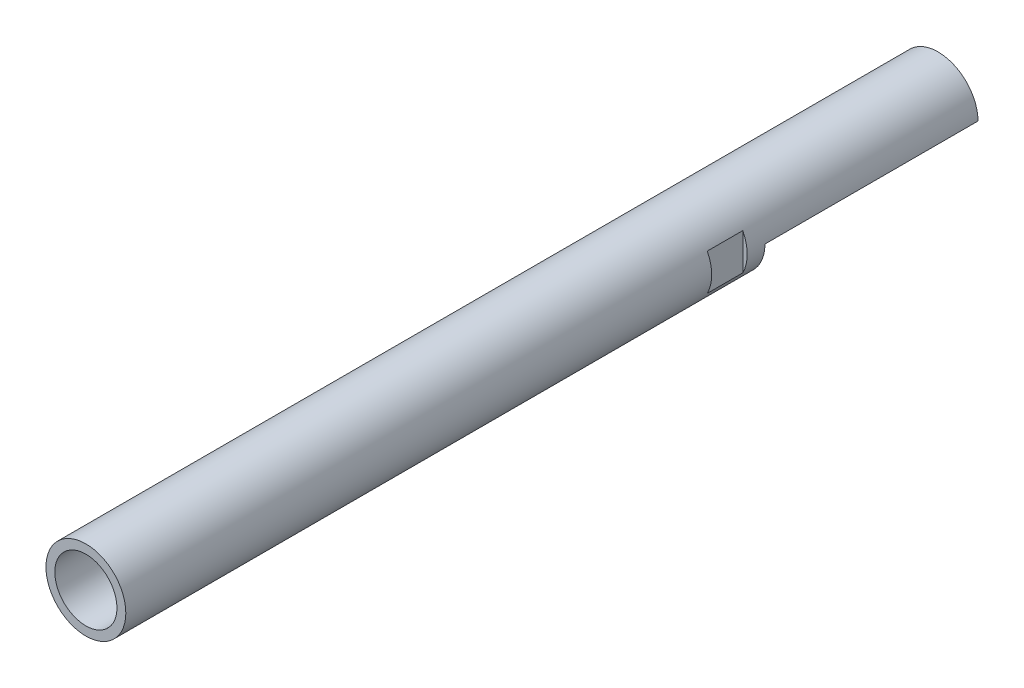
ISO-10303-21;
HEADER;
FILE_DESCRIPTION(('STEP AP214'),'2;1');
FILE_NAME('part.step','',(''),(''),'','','');
FILE_SCHEMA(('AUTOMOTIVE_DESIGN { 1 0 10303 214 1 1 1 1 }'));
ENDSEC;
DATA;
#1=APPLICATION_CONTEXT('core data for automotive mechanical design processes');
#2=APPLICATION_PROTOCOL_DEFINITION('international standard','automotive_design',2000,#1);
#3=PRODUCT_CONTEXT('',#1,'mechanical');
#4=PRODUCT('Part','Part','',(#3));
#5=PRODUCT_RELATED_PRODUCT_CATEGORY('part','',(#4));
#6=PRODUCT_DEFINITION_FORMATION('','',#4);
#7=PRODUCT_DEFINITION_CONTEXT('part definition',#1,'design');
#8=PRODUCT_DEFINITION('design','',#6,#7);
#9=PRODUCT_DEFINITION_SHAPE('','',#8);
#10=(LENGTH_UNIT() NAMED_UNIT(*) SI_UNIT(.MILLI.,.METRE.));
#11=(NAMED_UNIT(*) PLANE_ANGLE_UNIT() SI_UNIT($,.RADIAN.));
#12=(NAMED_UNIT(*) SI_UNIT($,.STERADIAN.) SOLID_ANGLE_UNIT());
#13=UNCERTAINTY_MEASURE_WITH_UNIT(LENGTH_MEASURE(1.E-05),#10,'distance_accuracy_value','');
#14=(GEOMETRIC_REPRESENTATION_CONTEXT(3) GLOBAL_UNCERTAINTY_ASSIGNED_CONTEXT((#13)) GLOBAL_UNIT_ASSIGNED_CONTEXT((#10,
#11,#12)) REPRESENTATION_CONTEXT('',''));
#15=CARTESIAN_POINT('',(0.,0.,0.));
#16=DIRECTION('',(0.,0.,1.));
#17=DIRECTION('',(1.,0.,0.));
#18=AXIS2_PLACEMENT_3D('',#15,#16,#17);
#19=CARTESIAN_POINT('',(0.,0.,304.8));
#20=DIRECTION('',(0.,0.,-1.));
#21=DIRECTION('',(-1.,0.,0.));
#22=AXIS2_PLACEMENT_3D('',#19,#20,#21);
#23=CYLINDRICAL_SURFACE('',#22,14.2875);
#24=CARTESIAN_POINT('',(0.,0.,95.25));
#25=DIRECTION('',(0.,0.,-1.));
#26=DIRECTION('',(-1.,0.,0.));
#27=AXIS2_PLACEMENT_3D('',#24,#25,#26);
#28=CIRCLE('',#27,14.2875);
#29=CARTESIAN_POINT('',(12.7,6.54543018066803,95.25));
#30=VERTEX_POINT('',#29);
#31=CARTESIAN_POINT('',(12.7,-6.54543018066804,95.25));
#32=VERTEX_POINT('',#31);
#33=EDGE_CURVE('E129',#30,#32,#28,.T.);
#34=ORIENTED_EDGE('',*,*,#33,.F.);
#35=DIRECTION('',(0.,0.,-1.));
#36=VECTOR('',#35,1.);
#37=CARTESIAN_POINT('',(12.7,6.54543018066803,95.25));
#38=LINE('',#37,#36);
#39=CARTESIAN_POINT('',(12.7,6.54543018066803,82.55));
#40=VERTEX_POINT('',#39);
#41=EDGE_CURVE('E133',#30,#40,#38,.T.);
#42=ORIENTED_EDGE('',*,*,#41,.T.);
#43=CARTESIAN_POINT('',(0.,0.,82.55));
#44=DIRECTION('',(0.,0.,-1.));
#45=DIRECTION('',(-1.,0.,0.));
#46=AXIS2_PLACEMENT_3D('',#43,#44,#45);
#47=CIRCLE('',#46,14.2875);
#48=CARTESIAN_POINT('',(12.7,-6.54543018066803,82.55));
#49=VERTEX_POINT('',#48);
#50=EDGE_CURVE('E130',#40,#49,#47,.T.);
#51=ORIENTED_EDGE('',*,*,#50,.T.);
#52=DIRECTION('',(0.,0.,-1.));
#53=VECTOR('',#52,1.);
#54=CARTESIAN_POINT('',(12.7,-6.54543018066804,95.25));
#55=LINE('',#54,#53);
#56=EDGE_CURVE('E123',#32,#49,#55,.T.);
#57=ORIENTED_EDGE('',*,*,#56,.F.);
#58=EDGE_LOOP('',(#34,#42,#51,#57));
#59=FACE_BOUND('',#58,.T.);
#60=CARTESIAN_POINT('',(0.,0.,304.8));
#61=DIRECTION('',(0.,0.,1.));
#62=DIRECTION('',(1.,0.,0.));
#63=AXIS2_PLACEMENT_3D('',#60,#61,#62);
#64=CIRCLE('',#63,14.2875);
#65=CARTESIAN_POINT('',(14.2875,0.,304.8));
#66=VERTEX_POINT('',#65);
#67=EDGE_CURVE('E11',#66,#66,#64,.T.);
#68=ORIENTED_EDGE('',*,*,#67,.F.);
#69=EDGE_LOOP('',(#68));
#70=FACE_BOUND('',#69,.T.);
#71=CARTESIAN_POINT('',(0.,0.,76.2));
#72=DIRECTION('',(0.,0.,-1.));
#73=DIRECTION('',(-1.,0.,0.));
#74=AXIS2_PLACEMENT_3D('',#71,#72,#73);
#75=CIRCLE('',#74,14.2875);
#76=CARTESIAN_POINT('',(14.2875,0.,76.2));
#77=VERTEX_POINT('',#76);
#78=CARTESIAN_POINT('',(-14.2875,0.,76.2));
#79=VERTEX_POINT('',#78);
#80=EDGE_CURVE('E141',#77,#79,#75,.T.);
#81=ORIENTED_EDGE('',*,*,#80,.F.);
#82=DIRECTION('',(0.,0.,-1.));
#83=VECTOR('',#82,1.);
#84=CARTESIAN_POINT('',(14.2875,0.,76.2));
#85=LINE('',#84,#83);
#86=CARTESIAN_POINT('',(14.2875,0.,0.));
#87=VERTEX_POINT('',#86);
#88=EDGE_CURVE('E150',#77,#87,#85,.T.);
#89=ORIENTED_EDGE('',*,*,#88,.T.);
#90=CARTESIAN_POINT('',(0.,0.,0.));
#91=DIRECTION('',(0.,0.,1.));
#92=DIRECTION('',(1.,0.,0.));
#93=AXIS2_PLACEMENT_3D('',#90,#91,#92);
#94=CIRCLE('',#93,14.2875);
#95=CARTESIAN_POINT('',(-14.2875,0.,0.));
#96=VERTEX_POINT('',#95);
#97=EDGE_CURVE('E45',#87,#96,#94,.T.);
#98=ORIENTED_EDGE('',*,*,#97,.T.);
#99=DIRECTION('',(0.,0.,-1.));
#100=VECTOR('',#99,1.);
#101=CARTESIAN_POINT('',(-14.2875,0.,76.2));
#102=LINE('',#101,#100);
#103=EDGE_CURVE('E148',#79,#96,#102,.T.);
#104=ORIENTED_EDGE('',*,*,#103,.F.);
#105=EDGE_LOOP('',(#81,#89,#98,#104));
#106=FACE_BOUND('',#105,.T.);
#107=CARTESIAN_POINT('',(0.,0.,95.25));
#108=DIRECTION('',(0.,0.,-1.));
#109=DIRECTION('',(-1.,0.,0.));
#110=AXIS2_PLACEMENT_3D('',#107,#108,#109);
#111=CIRCLE('',#110,14.2875);
#112=CARTESIAN_POINT('',(6.54543018066803,-12.7,95.25));
#113=VERTEX_POINT('',#112);
#114=CARTESIAN_POINT('',(-6.54543018066803,-12.7,95.25));
#115=VERTEX_POINT('',#114);
#116=EDGE_CURVE('E111',#113,#115,#111,.T.);
#117=ORIENTED_EDGE('',*,*,#116,.F.);
#118=DIRECTION('',(0.,0.,-1.));
#119=VECTOR('',#118,1.);
#120=CARTESIAN_POINT('',(6.54543018066803,-12.7,95.25));
#121=LINE('',#120,#119);
#122=CARTESIAN_POINT('',(6.54543018066803,-12.7,82.55));
#123=VERTEX_POINT('',#122);
#124=EDGE_CURVE('E102',#113,#123,#121,.T.);
#125=ORIENTED_EDGE('',*,*,#124,.T.);
#126=CARTESIAN_POINT('',(0.,0.,82.55));
#127=DIRECTION('',(0.,0.,-1.));
#128=DIRECTION('',(-1.,0.,0.));
#129=AXIS2_PLACEMENT_3D('',#126,#127,#128);
#130=CIRCLE('',#129,14.2875);
#131=CARTESIAN_POINT('',(-6.54543018066803,-12.7,82.55));
#132=VERTEX_POINT('',#131);
#133=EDGE_CURVE('E116',#123,#132,#130,.T.);
#134=ORIENTED_EDGE('',*,*,#133,.T.);
#135=DIRECTION('',(0.,0.,-1.));
#136=VECTOR('',#135,1.);
#137=CARTESIAN_POINT('',(-6.54543018066803,-12.7,95.25));
#138=LINE('',#137,#136);
#139=EDGE_CURVE('E110',#115,#132,#138,.T.);
#140=ORIENTED_EDGE('',*,*,#139,.F.);
#141=EDGE_LOOP('',(#117,#125,#134,#140));
#142=FACE_BOUND('',#141,.T.);
#143=CARTESIAN_POINT('',(-3.175,-13.930255964985,171.45));
#144=CARTESIAN_POINT('',(-3.17499404604868,-13.930259519501,171.625962258749));
#145=CARTESIAN_POINT('',(-3.16032218368744,-13.9336263325875,171.801995442595));
#146=CARTESIAN_POINT('',(-3.10208967570228,-13.9467040574412,172.149050586416));
#147=CARTESIAN_POINT('',(-3.05850857851012,-13.9564194603865,172.320068909173));
#148=CARTESIAN_POINT('',(-2.94390188320744,-13.9810409414811,172.652023920353));
#149=CARTESIAN_POINT('',(-2.87290695420969,-13.9959412172404,172.812971642226));
#150=CARTESIAN_POINT('',(-2.70557630453557,-14.029246552643,173.120677073703));
#151=CARTESIAN_POINT('',(-2.60924093365102,-14.047651563907,173.267434979142));
#152=CARTESIAN_POINT('',(-2.39217370591358,-14.0862510896236,173.545154832047));
#153=CARTESIAN_POINT('',(-2.27108337024511,-14.1064691172362,173.675833372365));
#154=CARTESIAN_POINT('',(-2.00871721519604,-14.1462109672236,173.915201369497));
#155=CARTESIAN_POINT('',(-1.86743979669659,-14.1657347344495,174.023889082659));
#156=CARTESIAN_POINT('',(-1.56680526306462,-14.2021447732274,174.21731531784));
#157=CARTESIAN_POINT('',(-1.40726829374625,-14.219000064093,174.301780633507));
#158=CARTESIAN_POINT('',(-1.07582705784745,-14.2479081363258,174.442595935231));
#159=CARTESIAN_POINT('',(-0.903924227211027,-14.2599614742443,174.498949179698));
#160=CARTESIAN_POINT('',(-0.555578639171222,-14.2777413909176,174.58104757479));
#161=CARTESIAN_POINT('',(-0.379254112365793,-14.2835670469651,174.607272560856));
#162=CARTESIAN_POINT('',(-0.0246184067353089,-14.2885786896136,174.62987088001));
#163=CARTESIAN_POINT('',(0.153692535319015,-14.2877654592567,174.62624773362));
#164=CARTESIAN_POINT('',(0.503929524483275,-14.2796664709516,174.589608715538));
#165=CARTESIAN_POINT('',(0.675912707619356,-14.2724946262242,174.557110119443));
#166=CARTESIAN_POINT('',(1.01192146730017,-14.2526143271741,174.464467765256));
#167=CARTESIAN_POINT('',(1.17594667614171,-14.2399056172874,174.404322731085));
#168=CARTESIAN_POINT('',(1.4928116089081,-14.2101973003647,174.257641428615));
#169=CARTESIAN_POINT('',(1.64555808316925,-14.1931661867752,174.170910362486));
#170=CARTESIAN_POINT('',(1.93451660426487,-14.1566784379842,173.973664475856));
#171=CARTESIAN_POINT('',(2.07072632689939,-14.1372214626108,173.863146318176));
#172=CARTESIAN_POINT('',(2.32582242095956,-14.0975265059119,173.618651692258));
#173=CARTESIAN_POINT('',(2.44427409683097,-14.0772807252366,173.484222538146));
#174=CARTESIAN_POINT('',(2.65703531045117,-14.0386803528947,173.197198138158));
#175=CARTESIAN_POINT('',(2.75134415041243,-14.0203258158989,173.044602367408));
#176=CARTESIAN_POINT('',(2.91334453391602,-13.9875646328247,172.724857927247));
#177=CARTESIAN_POINT('',(2.98095157937149,-13.9731705625883,172.557665071298));
#178=CARTESIAN_POINT('',(3.08697740368037,-13.9501326612632,172.213895203089));
#179=CARTESIAN_POINT('',(3.1254009782066,-13.9414878854313,172.037319737763));
#180=CARTESIAN_POINT('',(3.17128999504126,-13.9311206720645,171.683775270537));
#181=CARTESIAN_POINT('',(3.1793894179382,-13.9292564979198,171.506892616963));
#182=CARTESIAN_POINT('',(3.16611869036104,-13.9322788482822,171.15430443479));
#183=CARTESIAN_POINT('',(3.1447506349786,-13.9371648928594,170.978598823396));
#184=CARTESIAN_POINT('',(3.07370221749834,-13.9530030866465,170.63557513423));
#185=CARTESIAN_POINT('',(3.02437312088927,-13.9638799283206,170.468180501719));
#186=CARTESIAN_POINT('',(2.89918418032709,-13.9904058599556,170.144032598082));
#187=CARTESIAN_POINT('',(2.8233217299964,-14.0060554187221,169.987280374169));
#188=CARTESIAN_POINT('',(2.64583021389399,-14.0406735005904,169.68612938218));
#189=CARTESIAN_POINT('',(2.54381181722467,-14.0596906963536,169.541965787461));
#190=CARTESIAN_POINT('',(2.31741193066364,-14.0987739044538,169.272571732614));
#191=CARTESIAN_POINT('',(2.19302756963037,-14.1188400512109,169.147343707067));
#192=CARTESIAN_POINT('',(1.92255332820072,-14.1582288260966,168.91690349218));
#193=CARTESIAN_POINT('',(1.7760908881151,-14.1775296321132,168.812124218057));
#194=CARTESIAN_POINT('',(1.46727570740137,-14.2128067191643,168.628656686903));
#195=CARTESIAN_POINT('',(1.30492372176574,-14.2287831580436,168.549967190994));
#196=CARTESIAN_POINT('',(0.969965516255228,-14.2555196334235,168.421510193019));
#197=CARTESIAN_POINT('',(0.797433616226865,-14.2663132284701,168.371556201518));
#198=CARTESIAN_POINT('',(0.446159075287994,-14.2816131801047,168.301407808474));
#199=CARTESIAN_POINT('',(0.26741737208123,-14.2861204817538,168.281208933617));
#200=CARTESIAN_POINT('',(-0.0870979422953432,-14.2883108188044,168.271350682989));
#201=CARTESIAN_POINT('',(-0.262853020356216,-14.286138103284,168.281045786328));
#202=CARTESIAN_POINT('',(-0.610162040668767,-14.275522732602,168.329252734009));
#203=CARTESIAN_POINT('',(-0.781716063157475,-14.267080197286,168.367764027538));
#204=CARTESIAN_POINT('',(-1.11523507709879,-14.2448857383981,168.472196642047));
#205=CARTESIAN_POINT('',(-1.27723087619186,-14.2311520842578,168.538023705442));
#206=CARTESIAN_POINT('',(-1.58796280084769,-14.1998396361702,168.695128388119));
#207=CARTESIAN_POINT('',(-1.73669759306774,-14.1822604561825,168.786408562811));
#208=CARTESIAN_POINT('',(-2.0198253029721,-14.1447437865216,168.993918865473));
#209=CARTESIAN_POINT('',(-2.15388151644881,-14.1247669543449,169.110601319157));
#210=CARTESIAN_POINT('',(-2.40073137511054,-14.0849144764458,169.364695141618));
#211=CARTESIAN_POINT('',(-2.51351986498645,-14.0650388563904,169.502111521817));
#212=CARTESIAN_POINT('',(-2.71614663687899,-14.0273305013928,169.796070268413));
#213=CARTESIAN_POINT('',(-2.80564408799535,-14.0095300058213,169.952851954076));
#214=CARTESIAN_POINT('',(-2.95687791790409,-13.9783953379605,170.279594821402));
#215=CARTESIAN_POINT('',(-3.01863745352613,-13.9650574424787,170.449544870018));
#216=CARTESIAN_POINT('',(-3.10180592276854,-13.9467847451289,170.758019027563));
#217=CARTESIAN_POINT('',(-3.12920034001176,-13.940628146666,170.894888440797));
#218=CARTESIAN_POINT('',(-3.16579926545841,-13.9323624532779,171.171157143571));
#219=CARTESIAN_POINT('',(-3.17500471829016,-13.9302531481602,171.310556301352));
#220=CARTESIAN_POINT('',(-3.175,-13.930255964985,171.45));
#221=B_SPLINE_CURVE_WITH_KNOTS('',3,(#143,#144,#145,#146,#147,#148,#149,#150,#151,#152,#153,
#154,#155,#156,#157,#158,#159,#160,#161,#162,#163,#164,#165,#166,#167,#168,#169,#170,#171,#172,
#173,#174,#175,#176,#177,#178,#179,#180,#181,#182,#183,#184,#185,#186,#187,#188,#189,#190,#191,
#192,#193,#194,#195,#196,#197,#198,#199,#200,#201,#202,#203,#204,#205,#206,#207,#208,#209,#210,
#211,#212,#213,#214,#215,#216,#217,#218,#219,#220),.UNSPECIFIED.,.T.,.F.,(4,2,2,2,2,2,2,2,2,2,2,
2,2,2,2,2,2,2,2,2,2,2,2,2,2,2,2,2,2,2,2,2,2,2,2,2,2,2,4),(0.,0.527375623270274,1.05512473195785,
1.58228512612352,2.10943824390794,2.64484792847433,3.18030004903129,3.72157327570461,
4.26278374999437,4.79524967222896,5.32765279219154,5.85070651422449,6.37378438131147,
6.90079039585308,7.42787039426262,7.96626625085543,8.50467766666054,9.04477949502387,
9.58479255010871,10.1134505235966,10.6420709122667,11.1641930950071,11.6863665803431,
12.2168162560825,12.7473340748624,13.2880901059809,13.8288204555144,14.366000755148,
14.9031002881155,15.4286837026383,15.9542570710682,16.4780317470367,17.0018590272636,
17.5359134526346,18.0700971671722,18.6117066731651,19.1528631754363,19.5708109075415,
19.988736933318),.UNSPECIFIED.);
#222=CARTESIAN_POINT('',(-3.175,-13.930255964985,171.45));
#223=VERTEX_POINT('',#222);
#224=EDGE_CURVE('E135',#223,#223,#221,.T.);
#225=ORIENTED_EDGE('',*,*,#224,.T.);
#226=EDGE_LOOP('',(#225));
#227=FACE_BOUND('',#226,.T.);
#228=ADVANCED_FACE('F37',(#59,#70,#106,#142,#227),#23,.T.);
#229=CARTESIAN_POINT('',(0.,0.,304.8));
#230=DIRECTION('',(0.,0.,-1.));
#231=DIRECTION('',(-1.,0.,0.));
#232=AXIS2_PLACEMENT_3D('',#229,#230,#231);
#233=CYLINDRICAL_SURFACE('',#232,9.525);
#234=CARTESIAN_POINT('',(0.,0.,285.75));
#235=DIRECTION('',(0.,0.,1.));
#236=DIRECTION('',(1.,0.,0.));
#237=AXIS2_PLACEMENT_3D('',#234,#235,#236);
#238=CIRCLE('',#237,9.525);
#239=CARTESIAN_POINT('',(9.525,0.,285.75));
#240=VERTEX_POINT('',#239);
#241=EDGE_CURVE('E40',#240,#240,#238,.T.);
#242=ORIENTED_EDGE('',*,*,#241,.T.);
#243=EDGE_LOOP('',(#242));
#244=FACE_BOUND('',#243,.T.);
#245=DIRECTION('',(0.,0.,-1.));
#246=VECTOR('',#245,1.);
#247=CARTESIAN_POINT('',(9.525,0.,304.8));
#248=LINE('',#247,#246);
#249=CARTESIAN_POINT('',(9.525,0.,76.2));
#250=VERTEX_POINT('',#249);
#251=CARTESIAN_POINT('',(9.52499999999999,0.,0.));
#252=VERTEX_POINT('',#251);
#253=EDGE_CURVE('E159',#250,#252,#248,.T.);
#254=ORIENTED_EDGE('',*,*,#253,.F.);
#255=CARTESIAN_POINT('',(0.,0.,76.2));
#256=DIRECTION('',(0.,0.,-1.));
#257=DIRECTION('',(-1.,0.,0.));
#258=AXIS2_PLACEMENT_3D('',#255,#256,#257);
#259=CIRCLE('',#258,9.525);
#260=CARTESIAN_POINT('',(-9.525,0.,76.2));
#261=VERTEX_POINT('',#260);
#262=EDGE_CURVE('E153',#250,#261,#259,.T.);
#263=ORIENTED_EDGE('',*,*,#262,.T.);
#264=DIRECTION('',(0.,0.,-1.));
#265=VECTOR('',#264,1.);
#266=CARTESIAN_POINT('',(-9.525,0.,304.8));
#267=LINE('',#266,#265);
#268=CARTESIAN_POINT('',(-9.525,0.,0.));
#269=VERTEX_POINT('',#268);
#270=EDGE_CURVE('E157',#269,#261,#267,.F.);
#271=ORIENTED_EDGE('',*,*,#270,.F.);
#272=CARTESIAN_POINT('',(0.,0.,0.));
#273=DIRECTION('',(0.,0.,1.));
#274=DIRECTION('',(1.,0.,0.));
#275=AXIS2_PLACEMENT_3D('',#272,#273,#274);
#276=CIRCLE('',#275,9.525);
#277=EDGE_CURVE('E167',#252,#269,#276,.T.);
#278=ORIENTED_EDGE('',*,*,#277,.F.);
#279=EDGE_LOOP('',(#254,#263,#271,#278));
#280=FACE_BOUND('',#279,.T.);
#281=CARTESIAN_POINT('',(3.175,-8.98025612106916,171.45));
#282=CARTESIAN_POINT('',(3.17500081898398,-8.98025555134128,171.622936455105));
#283=CARTESIAN_POINT('',(3.16082293820153,-8.98530617498472,171.79586798944));
#284=CARTESIAN_POINT('',(3.10467734311197,-9.00485797707984,172.136607786657));
#285=CARTESIAN_POINT('',(3.06270505113466,-9.01936071226449,172.304415200845));
#286=CARTESIAN_POINT('',(2.95260866704957,-9.05599546711914,172.629915385266));
#287=CARTESIAN_POINT('',(2.8845358279553,-9.07811252608947,172.787627275981));
#288=CARTESIAN_POINT('',(2.72434567030138,-9.12746212382781,173.08944315414));
#289=CARTESIAN_POINT('',(2.63222304663108,-9.15469579088969,173.233544129608));
#290=CARTESIAN_POINT('',(2.42268738995613,-9.21240503868728,173.509685880424));
#291=CARTESIAN_POINT('',(2.30449228387488,-9.24296141131745,173.641116486033));
#292=CARTESIAN_POINT('',(2.04783584340568,-9.30319020743185,173.882706593888));
#293=CARTESIAN_POINT('',(1.90937126079127,-9.33286248831954,173.992862680274));
#294=CARTESIAN_POINT('',(1.61164431278889,-9.38891527476712,174.191545499021));
#295=CARTESIAN_POINT('',(1.45193356813785,-9.41518969452598,174.279432906712));
#296=CARTESIAN_POINT('',(1.11896913298521,-9.46053437997871,174.42685328278));
#297=CARTESIAN_POINT('',(0.945719107056872,-9.47960658694532,174.486393892837));
#298=CARTESIAN_POINT('',(0.596991495351313,-9.50782564496304,174.573361338458));
#299=CARTESIAN_POINT('',(0.421801146658144,-9.5172947441875,174.601833441866));
#300=CARTESIAN_POINT('',(0.0688907525664557,-9.52638456092937,174.62917923142));
#301=CARTESIAN_POINT('',(-0.108828629001898,-9.52600781684693,174.628060546496));
#302=CARTESIAN_POINT('',(-0.454353660740387,-9.51566675789472,174.596919491753));
#303=CARTESIAN_POINT('',(-0.622274754278534,-9.50607905597498,174.568032472093));
#304=CARTESIAN_POINT('',(-0.950732918260417,-9.47886621303647,174.484052285387));
#305=CARTESIAN_POINT('',(-1.11126948744903,-9.46124052729002,174.428957342239));
#306=CARTESIAN_POINT('',(-1.42288410762328,-9.41945253180987,174.293462317553));
#307=CARTESIAN_POINT('',(-1.5738101015761,-9.39520735013749,174.212739145115));
#308=CARTESIAN_POINT('',(-1.86030973354927,-9.34270397898568,174.0285454352));
#309=CARTESIAN_POINT('',(-1.99587908667348,-9.31444467439657,173.925068572435));
#310=CARTESIAN_POINT('',(-2.25457025130042,-9.25532159123421,173.692583800765));
#311=CARTESIAN_POINT('',(-2.37680549868225,-9.22439783161186,173.562603223853));
#312=CARTESIAN_POINT('',(-2.59803029922421,-9.16455289415259,173.283725295818));
#313=CARTESIAN_POINT('',(-2.69701626991891,-9.13563202542328,173.134825034813));
#314=CARTESIAN_POINT('',(-2.8701601697385,-9.08273917259531,172.819524738709));
#315=CARTESIAN_POINT('',(-2.94394402199776,-9.05884361979074,172.652905483066));
#316=CARTESIAN_POINT('',(-3.06210713863015,-9.01959241367421,172.308610823369));
#317=CARTESIAN_POINT('',(-3.1064987264983,-9.00423318171519,172.13094008717));
#318=CARTESIAN_POINT('',(-3.16281207065963,-8.98460345301983,171.778173221568));
#319=CARTESIAN_POINT('',(-3.17610837823673,-8.9798639401205,171.603322576423));
#320=CARTESIAN_POINT('',(-3.17374726853836,-8.9806993378791,171.253860726563));
#321=CARTESIAN_POINT('',(-3.15809511009497,-8.98627237514011,171.079249484124));
#322=CARTESIAN_POINT('',(-3.09951644367858,-9.00663737436701,170.741476633865));
#323=CARTESIAN_POINT('',(-3.05754530088867,-9.02110608274668,170.578127759271));
#324=CARTESIAN_POINT('',(-2.94866651362948,-9.05727657905498,170.260824050191));
#325=CARTESIAN_POINT('',(-2.88175444845385,-9.07897964918116,170.106870886699));
#326=CARTESIAN_POINT('',(-2.72248103184611,-9.12802586366624,169.807317163811));
#327=CARTESIAN_POINT('',(-2.62937980078821,-9.15552606488371,169.662136409612));
#328=CARTESIAN_POINT('',(-2.42120937702023,-9.21276315720815,169.388961283682));
#329=CARTESIAN_POINT('',(-2.30613370845861,-9.24250070609048,169.260971997251));
#330=CARTESIAN_POINT('',(-2.05070616623351,-9.30259247675171,169.019448650512));
#331=CARTESIAN_POINT('',(-1.9094045839856,-9.33290753359822,168.90690631169));
#332=CARTESIAN_POINT('',(-1.6091766501958,-9.38932753871621,168.707066248045));
#333=CARTESIAN_POINT('',(-1.45025092494493,-9.41543263651181,168.619767626559));
#334=CARTESIAN_POINT('',(-1.12007606322252,-9.46036988448665,168.473691167064));
#335=CARTESIAN_POINT('',(-0.948915816544782,-9.47924920264386,168.414727695055));
#336=CARTESIAN_POINT('',(-0.598355629061083,-9.50781089409934,168.326664418959));
#337=CARTESIAN_POINT('',(-0.418958686953577,-9.5174965870801,168.297553835129));
#338=CARTESIAN_POINT('',(-0.0660886913556076,-9.52632915775114,168.270992903602));
#339=CARTESIAN_POINT('',(0.107266498446079,-9.52594996283969,168.272118833765));
#340=CARTESIAN_POINT('',(0.45120288537557,-9.51586223949089,168.302486953365));
#341=CARTESIAN_POINT('',(0.621784306400523,-9.50615446789103,168.331726861885));
#342=CARTESIAN_POINT('',(0.952633729196801,-9.47867404980259,168.416548594779));
#343=CARTESIAN_POINT('',(1.11302251014812,-9.46103195296647,168.471704633746));
#344=CARTESIAN_POINT('',(1.42233126423386,-9.41949985236771,168.606398661233));
#345=CARTESIAN_POINT('',(1.57124915665223,-9.39560871852452,168.685941060251));
#346=CARTESIAN_POINT('',(1.8593880017804,-9.34294133528522,168.870533200924));
#347=CARTESIAN_POINT('',(1.99804734869541,-9.31401720161867,168.976416826087));
#348=CARTESIAN_POINT('',(2.25609475841496,-9.25490239414218,169.209267216921));
#349=CARTESIAN_POINT('',(2.37547664865808,-9.22471131854584,169.336240709184));
#350=CARTESIAN_POINT('',(2.59633024304515,-9.16505913446274,169.613609703989));
#351=CARTESIAN_POINT('',(2.69691791704333,-9.13567286363902,169.764727497351));
#352=CARTESIAN_POINT('',(2.87119803998104,-9.08241113800574,170.082636805416));
#353=CARTESIAN_POINT('',(2.94489751640183,-9.05853424386967,170.249424210369));
#354=CARTESIAN_POINT('',(3.06020415454822,-9.02021736105684,170.58627879125));
#355=CARTESIAN_POINT('',(3.10311136154972,-9.00539959321554,170.755856936693));
#356=CARTESIAN_POINT('',(3.16050396647392,-8.98542092737971,171.100292960232));
#357=CARTESIAN_POINT('',(3.17499917194918,-8.9802566971044,171.275148995279));
#358=CARTESIAN_POINT('',(3.175,-8.98025612106916,171.45));
#359=B_SPLINE_CURVE_WITH_KNOTS('',3,(#281,#282,#283,#284,#285,#286,#287,#288,#289,#290,#291,
#292,#293,#294,#295,#296,#297,#298,#299,#300,#301,#302,#303,#304,#305,#306,#307,#308,#309,#310,
#311,#312,#313,#314,#315,#316,#317,#318,#319,#320,#321,#322,#323,#324,#325,#326,#327,#328,#329,
#330,#331,#332,#333,#334,#335,#336,#337,#338,#339,#340,#341,#342,#343,#344,#345,#346,#347,#348,
#349,#350,#351,#352,#353,#354,#355,#356,#357,#358),.UNSPECIFIED.,.T.,.F.,(4,2,2,2,2,2,2,2,2,2,2,
2,2,2,2,2,2,2,2,2,2,2,2,2,2,2,2,2,2,2,2,2,2,2,2,2,2,2,4),(0.,0.518161856737926,1.03640907467316,
1.55364379231514,2.07099270263877,2.6067174633253,3.14252816921063,3.69231882006113,
4.24196117528058,4.77247962078669,5.30286129234891,5.81244090321183,6.32205505300828,
6.83836754181565,7.35482374200021,7.89559553605441,8.43645060268438,8.98501631501702,
9.53335188057257,10.0569487508209,10.5804505128322,11.0859695656586,11.5915782629155,
12.113223733109,12.6350231697726,13.1819271594322,13.7288117205517,14.2720628703095,
14.815117785382,15.3326491885149,15.8501386073106,16.3594083542837,16.868770261733,
17.3969527447801,17.9253040157361,18.4743376618725,19.023227709973,19.5473069861654,
20.0712053232972),.UNSPECIFIED.);
#360=CARTESIAN_POINT('',(3.175,-8.98025612106916,171.45));
#361=VERTEX_POINT('',#360);
#362=EDGE_CURVE('E350',#361,#361,#359,.T.);
#363=ORIENTED_EDGE('',*,*,#362,.T.);
#364=EDGE_LOOP('',(#363));
#365=FACE_BOUND('',#364,.T.);
#366=ADVANCED_FACE('F185',(#244,#280,#365),#233,.F.);
#367=CARTESIAN_POINT('',(0.,0.,304.8));
#368=DIRECTION('',(0.,0.,1.));
#369=DIRECTION('',(1.,0.,0.));
#370=AXIS2_PLACEMENT_3D('',#367,#368,#369);
#371=PLANE('',#370);
#372=CARTESIAN_POINT('',(0.,0.,304.8));
#373=DIRECTION('',(0.,0.,1.));
#374=DIRECTION('',(1.,0.,0.));
#375=AXIS2_PLACEMENT_3D('',#372,#373,#374);
#376=CIRCLE('',#375,11.1125);
#377=CARTESIAN_POINT('',(11.1125,0.,304.8));
#378=VERTEX_POINT('',#377);
#379=EDGE_CURVE('E161',#378,#378,#376,.T.);
#380=ORIENTED_EDGE('',*,*,#379,.F.);
#381=EDGE_LOOP('',(#380));
#382=FACE_BOUND('',#381,.T.);
#383=ORIENTED_EDGE('',*,*,#67,.T.);
#384=EDGE_LOOP('',(#383));
#385=FACE_BOUND('',#384,.T.);
#386=ADVANCED_FACE('F209',(#382,#385),#371,.T.);
#387=CARTESIAN_POINT('',(0.,0.,0.));
#388=DIRECTION('',(0.,0.,1.));
#389=DIRECTION('',(1.,0.,0.));
#390=AXIS2_PLACEMENT_3D('',#387,#388,#389);
#391=PLANE('',#390);
#392=ORIENTED_EDGE('',*,*,#97,.F.);
#393=DIRECTION('',(1.,0.,0.));
#394=VECTOR('',#393,1.);
#395=CARTESIAN_POINT('',(-14.2875,0.,0.));
#396=LINE('',#395,#394);
#397=EDGE_CURVE('E125',#252,#87,#396,.T.);
#398=ORIENTED_EDGE('',*,*,#397,.F.);
#399=ORIENTED_EDGE('',*,*,#277,.T.);
#400=EDGE_CURVE('E144',#96,#269,#396,.T.);
#401=ORIENTED_EDGE('',*,*,#400,.F.);
#402=EDGE_LOOP('',(#392,#398,#399,#401));
#403=FACE_BOUND('',#402,.T.);
#404=ADVANCED_FACE('F177',(#403),#391,.F.);
#405=CARTESIAN_POINT('',(0.,0.,285.75));
#406=DIRECTION('',(0.,0.,1.));
#407=DIRECTION('',(1.,0.,0.));
#408=AXIS2_PLACEMENT_3D('',#405,#406,#407);
#409=CYLINDRICAL_SURFACE('',#408,11.1125);
#410=CARTESIAN_POINT('',(0.,0.,285.75));
#411=DIRECTION('',(0.,0.,1.));
#412=DIRECTION('',(1.,0.,0.));
#413=AXIS2_PLACEMENT_3D('',#410,#411,#412);
#414=CIRCLE('',#413,11.1125);
#415=CARTESIAN_POINT('',(11.1125,0.,285.75));
#416=VERTEX_POINT('',#415);
#417=EDGE_CURVE('E162',#416,#416,#414,.T.);
#418=CARTESIAN_POINT('',(11.1125,0.,285.75));
#419=CARTESIAN_POINT('',(11.1125,0.,285.9484375));
#420=CARTESIAN_POINT('',(11.1125,0.,286.146875));
#421=CARTESIAN_POINT('',(11.1125,0.,286.54375));
#422=CARTESIAN_POINT('',(11.1125,0.,286.7421875));
#423=CARTESIAN_POINT('',(11.1125,0.,287.1390625));
#424=CARTESIAN_POINT('',(11.1125,0.,287.3375));
#425=CARTESIAN_POINT('',(11.1125,0.,287.734375));
#426=CARTESIAN_POINT('',(11.1125,0.,287.9328125));
#427=CARTESIAN_POINT('',(11.1125,0.,288.3296875));
#428=CARTESIAN_POINT('',(11.1125,0.,288.528125));
#429=CARTESIAN_POINT('',(11.1125,0.,288.925));
#430=CARTESIAN_POINT('',(11.1125,0.,289.1234375));
#431=CARTESIAN_POINT('',(11.1125,0.,289.5203125));
#432=CARTESIAN_POINT('',(11.1125,0.,289.71875));
#433=CARTESIAN_POINT('',(11.1125,0.,290.115625));
#434=CARTESIAN_POINT('',(11.1125,0.,290.3140625));
#435=CARTESIAN_POINT('',(11.1125,0.,290.7109375));
#436=CARTESIAN_POINT('',(11.1125,0.,290.909375));
#437=CARTESIAN_POINT('',(11.1125,0.,291.30625));
#438=CARTESIAN_POINT('',(11.1125,0.,291.5046875));
#439=CARTESIAN_POINT('',(11.1125,0.,291.9015625));
#440=CARTESIAN_POINT('',(11.1125,0.,292.1));
#441=CARTESIAN_POINT('',(11.1125,0.,292.496875));
#442=CARTESIAN_POINT('',(11.1125,0.,292.6953125));
#443=CARTESIAN_POINT('',(11.1125,0.,293.0921875));
#444=CARTESIAN_POINT('',(11.1125,0.,293.290625));
#445=CARTESIAN_POINT('',(11.1125,0.,293.6875));
#446=CARTESIAN_POINT('',(11.1125,0.,293.8859375));
#447=CARTESIAN_POINT('',(11.1125,0.,294.2828125));
#448=CARTESIAN_POINT('',(11.1125,0.,294.48125));
#449=CARTESIAN_POINT('',(11.1125,0.,294.878125));
#450=CARTESIAN_POINT('',(11.1125,0.,295.0765625));
#451=CARTESIAN_POINT('',(11.1125,0.,295.4734375));
#452=CARTESIAN_POINT('',(11.1125,0.,295.671875));
#453=CARTESIAN_POINT('',(11.1125,0.,296.06875));
#454=CARTESIAN_POINT('',(11.1125,0.,296.2671875));
#455=CARTESIAN_POINT('',(11.1125,0.,296.6640625));
#456=CARTESIAN_POINT('',(11.1125,0.,296.8625));
#457=CARTESIAN_POINT('',(11.1125,0.,297.259375));
#458=CARTESIAN_POINT('',(11.1125,0.,297.4578125));
#459=CARTESIAN_POINT('',(11.1125,0.,297.8546875));
#460=CARTESIAN_POINT('',(11.1125,0.,298.053125));
#461=CARTESIAN_POINT('',(11.1125,0.,298.45));
#462=CARTESIAN_POINT('',(11.1125,0.,298.6484375));
#463=CARTESIAN_POINT('',(11.1125,0.,299.0453125));
#464=CARTESIAN_POINT('',(11.1125,0.,299.24375));
#465=CARTESIAN_POINT('',(11.1125,0.,299.640625));
#466=CARTESIAN_POINT('',(11.1125,0.,299.8390625));
#467=CARTESIAN_POINT('',(11.1125,0.,300.2359375));
#468=CARTESIAN_POINT('',(11.1125,0.,300.434375));
#469=CARTESIAN_POINT('',(11.1125,0.,300.83125));
#470=CARTESIAN_POINT('',(11.1125,0.,301.0296875));
#471=CARTESIAN_POINT('',(11.1125,0.,301.4265625));
#472=CARTESIAN_POINT('',(11.1125,0.,301.625));
#473=CARTESIAN_POINT('',(11.1125,0.,302.021875));
#474=CARTESIAN_POINT('',(11.1125,0.,302.2203125));
#475=CARTESIAN_POINT('',(11.1125,0.,302.6171875));
#476=CARTESIAN_POINT('',(11.1125,0.,302.815625));
#477=CARTESIAN_POINT('',(11.1125,0.,303.2125));
#478=CARTESIAN_POINT('',(11.1125,0.,303.4109375));
#479=CARTESIAN_POINT('',(11.1125,0.,303.8078125));
#480=CARTESIAN_POINT('',(11.1125,0.,304.00625));
#481=CARTESIAN_POINT('',(11.1125,0.,304.403125));
#482=CARTESIAN_POINT('',(11.1125,0.,304.6015625));
#483=CARTESIAN_POINT('',(11.1125,0.,304.8));
#484=B_SPLINE_CURVE_WITH_KNOTS('',3,(#418,#419,#420,#421,#422,#423,#424,#425,#426,#427,#428,
#429,#430,#431,#432,#433,#434,#435,#436,#437,#438,#439,#440,#441,#442,#443,#444,#445,#446,#447,
#448,#449,#450,#451,#452,#453,#454,#455,#456,#457,#458,#459,#460,#461,#462,#463,#464,#465,#466,
#467,#468,#469,#470,#471,#472,#473,#474,#475,#476,#477,#478,#479,#480,#481,#482,#483),
.UNSPECIFIED.,.F.,.F.,(4,2,2,2,2,2,2,2,2,2,2,2,2,2,2,2,2,2,2,2,2,2,2,2,2,2,2,2,2,2,2,2,4),(0.,
0.5953125,1.190625,1.7859375,2.38125,2.9765625,3.571875,4.1671875,4.7625,5.3578125,5.953125,
6.5484375,7.14375,7.7390625,8.334375,8.92968750000001,9.52500000000001,10.1203125,10.715625,
11.3109375,11.90625,12.5015625,13.096875,13.6921875,14.2875,14.8828125,15.478125,16.0734375,
16.66875,17.2640625,17.859375,18.4546875,19.05),.UNSPECIFIED.);
#485=EDGE_CURVE('BSEAM200',#416,#378,#484,.T.);
#486=ORIENTED_EDGE('',*,*,#417,.F.);
#487=ORIENTED_EDGE('',*,*,#379,.T.);
#488=ORIENTED_EDGE('',*,*,#485,.T.);
#489=ORIENTED_EDGE('',*,*,#485,.F.);
#490=EDGE_LOOP('',(#486,#488,#487,#489));
#491=FACE_BOUND('',#490,.T.);
#492=ADVANCED_FACE('F200',(#491),#409,.F.);
#493=CARTESIAN_POINT('',(0.,0.,285.75));
#494=DIRECTION('',(0.,0.,1.));
#495=DIRECTION('',(1.,0.,0.));
#496=AXIS2_PLACEMENT_3D('',#493,#494,#495);
#497=PLANE('',#496);
#498=ORIENTED_EDGE('',*,*,#241,.F.);
#499=EDGE_LOOP('',(#498));
#500=FACE_BOUND('',#499,.T.);
#501=ORIENTED_EDGE('',*,*,#417,.T.);
#502=EDGE_LOOP('',(#501));
#503=FACE_BOUND('',#502,.T.);
#504=ADVANCED_FACE('F194',(#500,#503),#497,.T.);
#505=CARTESIAN_POINT('',(-14.2875,0.,76.2));
#506=DIRECTION('',(0.,1.,0.));
#507=DIRECTION('',(0.,0.,1.));
#508=AXIS2_PLACEMENT_3D('',#505,#506,#507);
#509=PLANE('',#508);
#510=ORIENTED_EDGE('',*,*,#253,.T.);
#511=ORIENTED_EDGE('',*,*,#397,.T.);
#512=ORIENTED_EDGE('',*,*,#88,.F.);
#513=DIRECTION('',(1.,0.,0.));
#514=VECTOR('',#513,1.);
#515=CARTESIAN_POINT('',(-14.2875,0.,76.2));
#516=LINE('',#515,#514);
#517=EDGE_CURVE('E143',#250,#77,#516,.T.);
#518=ORIENTED_EDGE('',*,*,#517,.F.);
#519=EDGE_LOOP('',(#510,#511,#512,#518));
#520=FACE_BOUND('',#519,.T.);
#521=ADVANCED_FACE('F192',(#520),#509,.F.);
#522=ORIENTED_EDGE('',*,*,#270,.T.);
#523=EDGE_CURVE('E145',#79,#261,#516,.T.);
#524=ORIENTED_EDGE('',*,*,#523,.F.);
#525=ORIENTED_EDGE('',*,*,#103,.T.);
#526=ORIENTED_EDGE('',*,*,#400,.T.);
#527=EDGE_LOOP('',(#522,#524,#525,#526));
#528=FACE_BOUND('',#527,.T.);
#529=ADVANCED_FACE('F181',(#528),#509,.F.);
#530=CARTESIAN_POINT('',(0.,0.,76.2));
#531=DIRECTION('',(0.,0.,-1.));
#532=DIRECTION('',(-1.,0.,0.));
#533=AXIS2_PLACEMENT_3D('',#530,#531,#532);
#534=PLANE('',#533);
#535=ORIENTED_EDGE('',*,*,#517,.T.);
#536=ORIENTED_EDGE('',*,*,#80,.T.);
#537=ORIENTED_EDGE('',*,*,#523,.T.);
#538=ORIENTED_EDGE('',*,*,#262,.F.);
#539=EDGE_LOOP('',(#535,#536,#537,#538));
#540=FACE_BOUND('',#539,.T.);
#541=ADVANCED_FACE('F190',(#540),#534,.T.);
#542=CARTESIAN_POINT('',(12.7,0.,95.25));
#543=DIRECTION('',(1.,0.,0.));
#544=DIRECTION('',(0.,1.,0.));
#545=AXIS2_PLACEMENT_3D('',#542,#543,#544);
#546=PLANE('',#545);
#547=DIRECTION('',(0.,-1.,0.));
#548=VECTOR('',#547,1.);
#549=CARTESIAN_POINT('',(12.7,0.,82.55));
#550=LINE('',#549,#548);
#551=EDGE_CURVE('E59',#40,#49,#550,.T.);
#552=ORIENTED_EDGE('',*,*,#551,.F.);
#553=ORIENTED_EDGE('',*,*,#41,.F.);
#554=DIRECTION('',(0.,-1.,0.));
#555=VECTOR('',#554,1.);
#556=CARTESIAN_POINT('',(12.7,0.,95.25));
#557=LINE('',#556,#555);
#558=EDGE_CURVE('E127',#30,#32,#557,.T.);
#559=ORIENTED_EDGE('',*,*,#558,.T.);
#560=ORIENTED_EDGE('',*,*,#56,.T.);
#561=EDGE_LOOP('',(#552,#553,#559,#560));
#562=FACE_BOUND('',#561,.T.);
#563=ADVANCED_FACE('F262',(#562),#546,.T.);
#564=CARTESIAN_POINT('',(0.,0.,95.25));
#565=DIRECTION('',(0.,0.,-1.));
#566=DIRECTION('',(-1.,0.,0.));
#567=AXIS2_PLACEMENT_3D('',#564,#565,#566);
#568=PLANE('',#567);
#569=ORIENTED_EDGE('',*,*,#558,.F.);
#570=ORIENTED_EDGE('',*,*,#33,.T.);
#571=EDGE_LOOP('',(#569,#570));
#572=FACE_BOUND('',#571,.T.);
#573=ADVANCED_FACE('F270',(#572),#568,.T.);
#574=CARTESIAN_POINT('',(0.,0.,82.55));
#575=DIRECTION('',(0.,0.,-1.));
#576=DIRECTION('',(-1.,0.,0.));
#577=AXIS2_PLACEMENT_3D('',#574,#575,#576);
#578=PLANE('',#577);
#579=ORIENTED_EDGE('',*,*,#551,.T.);
#580=ORIENTED_EDGE('',*,*,#50,.F.);
#581=EDGE_LOOP('',(#579,#580));
#582=FACE_BOUND('',#581,.T.);
#583=ADVANCED_FACE('F280',(#582),#578,.F.);
#584=CARTESIAN_POINT('',(0.,-12.7,95.25));
#585=DIRECTION('',(0.,1.,0.));
#586=DIRECTION('',(-1.,0.,0.));
#587=AXIS2_PLACEMENT_3D('',#584,#585,#586);
#588=PLANE('',#587);
#589=DIRECTION('',(1.,0.,0.));
#590=VECTOR('',#589,1.);
#591=CARTESIAN_POINT('',(0.,-12.7,82.55));
#592=LINE('',#591,#590);
#593=EDGE_CURVE('E52',#132,#123,#592,.T.);
#594=ORIENTED_EDGE('',*,*,#593,.T.);
#595=ORIENTED_EDGE('',*,*,#124,.F.);
#596=DIRECTION('',(1.,0.,0.));
#597=VECTOR('',#596,1.);
#598=CARTESIAN_POINT('',(0.,-12.7,95.25));
#599=LINE('',#598,#597);
#600=EDGE_CURVE('E105',#115,#113,#599,.T.);
#601=ORIENTED_EDGE('',*,*,#600,.F.);
#602=ORIENTED_EDGE('',*,*,#139,.T.);
#603=EDGE_LOOP('',(#594,#595,#601,#602));
#604=FACE_BOUND('',#603,.T.);
#605=ADVANCED_FACE('F104',(#604),#588,.F.);
#606=CARTESIAN_POINT('',(0.,0.,95.25));
#607=DIRECTION('',(0.,0.,-1.));
#608=DIRECTION('',(-1.,0.,0.));
#609=AXIS2_PLACEMENT_3D('',#606,#607,#608);
#610=PLANE('',#609);
#611=ORIENTED_EDGE('',*,*,#600,.T.);
#612=ORIENTED_EDGE('',*,*,#116,.T.);
#613=EDGE_LOOP('',(#611,#612));
#614=FACE_BOUND('',#613,.T.);
#615=ADVANCED_FACE('F114',(#614),#610,.T.);
#616=CARTESIAN_POINT('',(0.,0.,82.55));
#617=DIRECTION('',(0.,0.,-1.));
#618=DIRECTION('',(-1.,0.,0.));
#619=AXIS2_PLACEMENT_3D('',#616,#617,#618);
#620=PLANE('',#619);
#621=ORIENTED_EDGE('',*,*,#593,.F.);
#622=ORIENTED_EDGE('',*,*,#133,.F.);
#623=EDGE_LOOP('',(#621,#622));
#624=FACE_BOUND('',#623,.T.);
#625=ADVANCED_FACE('F306',(#624),#620,.F.);
#626=CARTESIAN_POINT('',(0.,-14.2885,171.45));
#627=DIRECTION('',(0.,1.,0.));
#628=DIRECTION('',(-1.,0.,0.));
#629=AXIS2_PLACEMENT_3D('',#626,#627,#628);
#630=CYLINDRICAL_SURFACE('',#629,3.175);
#631=ORIENTED_EDGE('',*,*,#224,.F.);
#632=EDGE_LOOP('',(#631));
#633=FACE_BOUND('',#632,.T.);
#634=ORIENTED_EDGE('',*,*,#362,.F.);
#635=EDGE_LOOP('',(#634));
#636=FACE_BOUND('',#635,.T.);
#637=ADVANCED_FACE('F315',(#633,#636),#630,.F.);
#638=CLOSED_SHELL('',(#228,#366,#386,#404,#492,#504,#521,#529,#541,#563,#573,#583,#605,#615,
#625,#637));
#639=MANIFOLD_SOLID_BREP('B2',#638);
#640=ADVANCED_BREP_SHAPE_REPRESENTATION('',(#18,#639),#14);
#641=SHAPE_DEFINITION_REPRESENTATION(#9,#640);
ENDSEC;
END-ISO-10303-21;
